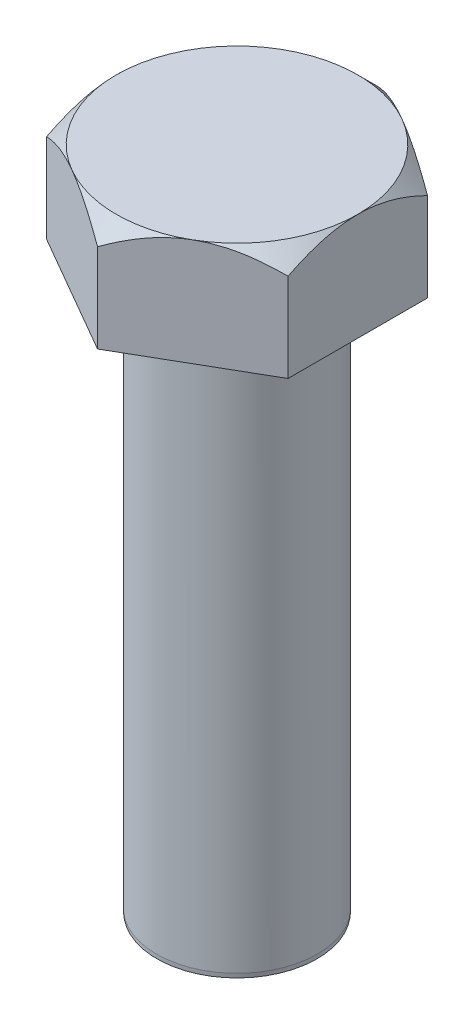
ISO-10303-21;
HEADER;
FILE_DESCRIPTION(('STEP AP214'),'2;1');
FILE_NAME('part.step','',(''),(''),'','','');
FILE_SCHEMA(('AUTOMOTIVE_DESIGN { 1 0 10303 214 1 1 1 1 }'));
ENDSEC;
DATA;
#1=APPLICATION_CONTEXT('core data for automotive mechanical design processes');
#2=APPLICATION_PROTOCOL_DEFINITION('international standard','automotive_design',2000,#1);
#3=PRODUCT_CONTEXT('',#1,'mechanical');
#4=PRODUCT('Part','Part','',(#3));
#5=PRODUCT_RELATED_PRODUCT_CATEGORY('part','',(#4));
#6=PRODUCT_DEFINITION_FORMATION('','',#4);
#7=PRODUCT_DEFINITION_CONTEXT('part definition',#1,'design');
#8=PRODUCT_DEFINITION('design','',#6,#7);
#9=PRODUCT_DEFINITION_SHAPE('','',#8);
#10=(LENGTH_UNIT() NAMED_UNIT(*) SI_UNIT(.MILLI.,.METRE.));
#11=(NAMED_UNIT(*) PLANE_ANGLE_UNIT() SI_UNIT($,.RADIAN.));
#12=(NAMED_UNIT(*) SI_UNIT($,.STERADIAN.) SOLID_ANGLE_UNIT());
#13=UNCERTAINTY_MEASURE_WITH_UNIT(LENGTH_MEASURE(1.E-05),#10,'distance_accuracy_value','');
#14=(GEOMETRIC_REPRESENTATION_CONTEXT(3) GLOBAL_UNCERTAINTY_ASSIGNED_CONTEXT((#13)) GLOBAL_UNIT_ASSIGNED_CONTEXT((#10,
#11,#12)) REPRESENTATION_CONTEXT('',''));
#15=CARTESIAN_POINT('',(0.,0.,0.));
#16=DIRECTION('',(0.,0.,1.));
#17=DIRECTION('',(1.,0.,0.));
#18=AXIS2_PLACEMENT_3D('',#15,#16,#17);
#19=CARTESIAN_POINT('',(7.15009999999996,6.35,-4.12811215973283));
#20=DIRECTION('',(-0.499999999999995,0.,0.866025403784441));
#21=DIRECTION('',(0.866025403784442,0.,0.499999999999995));
#22=AXIS2_PLACEMENT_3D('',#19,#20,#21);
#23=PLANE('',#22);
#24=CARTESIAN_POINT('',(7.15029999999996,5.24376020805829,-4.12799668967899));
#25=CARTESIAN_POINT('',(7.02735981479973,5.31473208114426,-4.19897623869856));
#26=CARTESIAN_POINT('',(6.90347465758507,5.38352591509957,-4.27050136756504));
#27=CARTESIAN_POINT('',(6.65362901516201,5.51609496244518,-4.41474981647385));
#28=CARTESIAN_POINT('',(6.52766744128796,5.57986743492815,-4.48747376505758));
#29=CARTESIAN_POINT('',(6.14521985336649,5.76320280111308,-4.70827998289497));
#30=CARTESIAN_POINT('',(5.88549626774101,5.87400155292641,-4.85823146497073));
#31=CARTESIAN_POINT('',(5.36174291484116,6.06373669034418,-5.16062060425642));
#32=CARTESIAN_POINT('',(5.09784700922402,6.14315107326227,-5.31298097640252));
#33=CARTESIAN_POINT('',(4.69766469893423,6.23501393674774,-5.54402634097325));
#34=CARTESIAN_POINT('',(4.56368142899528,6.26107948825729,-5.62138161793941));
#35=CARTESIAN_POINT('',(4.29458046497126,6.30353452510466,-5.77674713195786));
#36=CARTESIAN_POINT('',(4.15946294347778,6.319925456437,-5.85475726936435));
#37=CARTESIAN_POINT('',(3.83019852397778,6.34740730224126,-6.04485817059725));
#38=CARTESIAN_POINT('',(3.63569685436158,6.35317340265754,-6.15715376190799));
#39=CARTESIAN_POINT('',(3.24704409240871,6.34349459202812,-6.38154253864277));
#40=CARTESIAN_POINT('',(3.05289314684432,6.32804224579773,-6.49363563932778));
#41=CARTESIAN_POINT('',(2.66642169813378,6.27683739902505,-6.71676503427492));
#42=CARTESIAN_POINT('',(2.47410348685935,6.24106219749936,-6.82780000532428));
#43=CARTESIAN_POINT('',(2.09277255135678,6.15115660179108,-7.04796152358701));
#44=CARTESIAN_POINT('',(1.90375957482909,6.09702761510223,-7.15708821646561));
#45=CARTESIAN_POINT('',(1.56823093998172,5.98566881448239,-7.35080576411556));
#46=CARTESIAN_POINT('',(1.42097225552798,5.93136793728872,-7.43582560522543));
#47=CARTESIAN_POINT('',(1.12909829468736,5.81401595028394,-7.6043391150862));
#48=CARTESIAN_POINT('',(0.984483098549458,5.75096457532957,-7.68783273750533));
#49=CARTESIAN_POINT('',(0.6983516080155,5.61752492778284,-7.85303083058874));
#50=CARTESIAN_POINT('',(0.55682717595113,5.54715972840591,-7.93473999953801));
#51=CARTESIAN_POINT('',(0.276398890261677,5.40001620595466,-8.0966453457692));
#52=CARTESIAN_POINT('',(0.137493492810105,5.32324181558632,-8.17684241437976));
#53=CARTESIAN_POINT('',(-0.000199999999999894,5.24376020805829,-8.25633978951933));
#54=B_SPLINE_CURVE_WITH_KNOTS('',3,(#24,#25,#26,#27,#28,#29,#30,#31,#32,#33,#34,#35,#36,#37,#38,
#39,#40,#41,#42,#43,#44,#45,#46,#47,#48,#49,#50,#51,#52,#53),.UNSPECIFIED.,.F.,.F.,(4,2,2,2,2,2,
2,2,2,2,2,2,2,2,4),(0.,0.476107132166216,0.952472371030046,1.91034566100054,2.85300915505907,
3.32341643946382,3.7937533977268,4.46670173744884,5.13988594609707,5.81382359601269,
6.48770957546597,7.02295690652281,7.55822045931063,8.09184389327706,8.6251422671035),.UNSPECIFIED.);
#55=CARTESIAN_POINT('',(7.15009999999996,5.24387568053451,-4.12811215973283));
#56=VERTEX_POINT('',#55);
#57=CARTESIAN_POINT('',(3.57504999999996,6.35,-6.19216823959914));
#58=VERTEX_POINT('',#57);
#59=EDGE_CURVE('E106',#56,#58,#54,.T.);
#60=ORIENTED_EDGE('',*,*,#59,.F.);
#61=DIRECTION('',(0.,-1.,0.));
#62=VECTOR('',#61,1.);
#63=CARTESIAN_POINT('',(7.15009999999996,6.35,-4.12811215973283));
#64=LINE('',#63,#62);
#65=CARTESIAN_POINT('',(7.15009999999996,0.,-4.12811215973283));
#66=VERTEX_POINT('',#65);
#67=EDGE_CURVE('E273',#56,#66,#64,.T.);
#68=ORIENTED_EDGE('',*,*,#67,.T.);
#69=DIRECTION('',(-0.866025403784441,0.,-0.499999999999995));
#70=VECTOR('',#69,1.);
#71=CARTESIAN_POINT('',(7.15009999999996,0.,-4.12811215973283));
#72=LINE('',#71,#70);
#73=CARTESIAN_POINT('',(0.,0.,-8.25622431946549));
#74=VERTEX_POINT('',#73);
#75=EDGE_CURVE('E115',#66,#74,#72,.T.);
#76=ORIENTED_EDGE('',*,*,#75,.T.);
#77=DIRECTION('',(0.,-1.,0.));
#78=VECTOR('',#77,1.);
#79=CARTESIAN_POINT('',(0.,6.35,-8.25622431946549));
#80=LINE('',#79,#78);
#81=CARTESIAN_POINT('',(0.,5.24387568053451,-8.25622431946549));
#82=VERTEX_POINT('',#81);
#83=EDGE_CURVE('E133',#82,#74,#80,.T.);
#84=ORIENTED_EDGE('',*,*,#83,.F.);
#85=EDGE_CURVE('E116',#58,#82,#54,.T.);
#86=ORIENTED_EDGE('',*,*,#85,.F.);
#87=EDGE_LOOP('',(#60,#68,#76,#84,#86));
#88=FACE_BOUND('',#87,.T.);
#89=ADVANCED_FACE('F36',(#88),#23,.F.);
#90=CARTESIAN_POINT('',(0.,6.35,-8.25622431946549));
#91=DIRECTION('',(0.500000000000001,0.,0.866025403784438));
#92=DIRECTION('',(0.866025403784438,0.,-0.500000000000001));
#93=AXIS2_PLACEMENT_3D('',#90,#91,#92);
#94=PLANE('',#93);
#95=CARTESIAN_POINT('',(0.0002,5.24376020805829,-8.25633978951933));
#96=CARTESIAN_POINT('',(-0.122740185200222,5.31473208114426,-8.18536024049976));
#97=CARTESIAN_POINT('',(-0.246625342414885,5.38352591509958,-8.11383511163327));
#98=CARTESIAN_POINT('',(-0.496470984837945,5.51609496244519,-7.96958666272447));
#99=CARTESIAN_POINT('',(-0.622432558711996,5.57986743492816,-7.89686271414073));
#100=CARTESIAN_POINT('',(-1.00488014663348,5.76320280111309,-7.67605649630334));
#101=CARTESIAN_POINT('',(-1.26460373225895,5.87400155292642,-7.52610501422758));
#102=CARTESIAN_POINT('',(-1.78835708515881,6.06373669034419,-7.22371587494188));
#103=CARTESIAN_POINT('',(-2.05225299077595,6.1431510732623,-7.07135550279578));
#104=CARTESIAN_POINT('',(-2.45243530106574,6.23501393674777,-6.84031013822504));
#105=CARTESIAN_POINT('',(-2.58641857100469,6.26107948825732,-6.76295486125888));
#106=CARTESIAN_POINT('',(-2.85551953502872,6.30353452510469,-6.60758934724042));
#107=CARTESIAN_POINT('',(-2.99063705652219,6.31992545643702,-6.52957920983393));
#108=CARTESIAN_POINT('',(-3.3199014760222,6.34740730224129,-6.33947830860103));
#109=CARTESIAN_POINT('',(-3.51440314563839,6.35317340265757,-6.22718271729029));
#110=CARTESIAN_POINT('',(-3.90305590759126,6.34349459202815,-6.00279394055551));
#111=CARTESIAN_POINT('',(-4.09720685315564,6.32804224579776,-5.89070083987049));
#112=CARTESIAN_POINT('',(-4.48367830186619,6.27683739902508,-5.66757144492336));
#113=CARTESIAN_POINT('',(-4.67599651314062,6.24106219749939,-5.556536473874));
#114=CARTESIAN_POINT('',(-5.05732744864318,6.15115660179112,-5.33637495561126));
#115=CARTESIAN_POINT('',(-5.24634042517087,6.09702761510226,-5.22724826273266));
#116=CARTESIAN_POINT('',(-5.58186906001824,5.98566881448243,-5.03353071508271));
#117=CARTESIAN_POINT('',(-5.72912774447198,5.93136793728875,-4.94851087397283));
#118=CARTESIAN_POINT('',(-6.02100170531261,5.81401595028396,-4.77999736411205));
#119=CARTESIAN_POINT('',(-6.16561690145052,5.7509645753296,-4.69650374169292));
#120=CARTESIAN_POINT('',(-6.45174839198449,5.61752492778286,-4.5313056486095));
#121=CARTESIAN_POINT('',(-6.59327282404887,5.54715972840593,-4.44959647966022));
#122=CARTESIAN_POINT('',(-6.87370110973833,5.40001620595466,-4.28769113342903));
#123=CARTESIAN_POINT('',(-7.0126065071899,5.32324181558632,-4.20749406481847));
#124=CARTESIAN_POINT('',(-7.15030000000001,5.24376020805829,-4.12799668967889));
#125=B_SPLINE_CURVE_WITH_KNOTS('',3,(#95,#96,#97,#98,#99,#100,#101,#102,#103,#104,#105,#106,
#107,#108,#109,#110,#111,#112,#113,#114,#115,#116,#117,#118,#119,#120,#121,#122,#123,#124),
.UNSPECIFIED.,.F.,.F.,(4,2,2,2,2,2,2,2,2,2,2,2,2,2,4),(0.,0.476107132166221,0.952472371030056,
1.91034566100056,2.85300915505911,3.32341643946385,3.79375339772684,4.46670173744889,
5.13988594609711,5.81382359601273,6.48770957546601,7.02295690652286,7.55822045931071,
8.09184389327715,8.62514226710361),.UNSPECIFIED.);
#126=CARTESIAN_POINT('',(-3.57505000000001,6.35,-6.19216823959911));
#127=VERTEX_POINT('',#126);
#128=EDGE_CURVE('E123',#82,#127,#125,.T.);
#129=ORIENTED_EDGE('',*,*,#128,.F.);
#130=ORIENTED_EDGE('',*,*,#83,.T.);
#131=DIRECTION('',(-0.866025403784438,0.,0.500000000000001));
#132=VECTOR('',#131,1.);
#133=CARTESIAN_POINT('',(0.,0.,-8.25622431946549));
#134=LINE('',#133,#132);
#135=CARTESIAN_POINT('',(-7.15010000000001,0.,-4.12811215973273));
#136=VERTEX_POINT('',#135);
#137=EDGE_CURVE('E264',#74,#136,#134,.T.);
#138=ORIENTED_EDGE('',*,*,#137,.T.);
#139=DIRECTION('',(0.,-1.,0.));
#140=VECTOR('',#139,1.);
#141=CARTESIAN_POINT('',(-7.15010000000001,6.35,-4.12811215973273));
#142=LINE('',#141,#140);
#143=CARTESIAN_POINT('',(-7.15010000000001,5.24387568053451,-4.12811215973273));
#144=VERTEX_POINT('',#143);
#145=EDGE_CURVE('E206',#144,#136,#142,.T.);
#146=ORIENTED_EDGE('',*,*,#145,.F.);
#147=EDGE_CURVE('E134',#127,#144,#125,.T.);
#148=ORIENTED_EDGE('',*,*,#147,.F.);
#149=EDGE_LOOP('',(#129,#130,#138,#146,#148));
#150=FACE_BOUND('',#149,.T.);
#151=ADVANCED_FACE('F194',(#150),#94,.F.);
#152=CARTESIAN_POINT('',(-7.15010000000001,6.35,-4.12811215973273));
#153=DIRECTION('',(1.,0.,0.));
#154=DIRECTION('',(0.,0.,-1.));
#155=AXIS2_PLACEMENT_3D('',#152,#153,#154);
#156=PLANE('',#155);
#157=CARTESIAN_POINT('',(-7.15010000000003,1.63089085788719,-9.47386909605649));
#158=CARTESIAN_POINT('',(-7.15010000000003,1.81121581560539,-9.24790249070521));
#159=CARTESIAN_POINT('',(-7.15010000000003,1.99016418725543,-9.02082114931031));
#160=CARTESIAN_POINT('',(-7.15010000000003,2.34465316669975,-8.56394073706759));
#161=CARTESIAN_POINT('',(-7.15010000000003,2.5201930563962,-8.33414110959574));
#162=CARTESIAN_POINT('',(-7.15010000000003,2.868446395647,-7.86968034981608));
#163=CARTESIAN_POINT('',(-7.15010000000003,3.0411284373893,-7.63499559658916));
#164=CARTESIAN_POINT('',(-7.15010000000002,3.38131039804522,-7.16191403046406));
#165=CARTESIAN_POINT('',(-7.15010000000002,3.54881066036877,-6.92351746513816));
#166=CARTESIAN_POINT('',(-7.15010000000002,3.89019859321875,-6.42356671095031));
#167=CARTESIAN_POINT('',(-7.15010000000002,4.06356649358224,-6.16165586234294));
#168=CARTESIAN_POINT('',(-7.15010000000002,4.40077381694092,-5.63166319550724));
#169=CARTESIAN_POINT('',(-7.15010000000002,4.56461143837196,-5.36358022380933));
#170=CARTESIAN_POINT('',(-7.15010000000002,4.87937516438839,-4.82096243326766));
#171=CARTESIAN_POINT('',(-7.15010000000002,5.03033869234989,-4.54644949317194));
#172=CARTESIAN_POINT('',(-7.15010000000001,5.31597281014485,-3.98913965325442));
#173=CARTESIAN_POINT('',(-7.15010000000001,5.45065169434768,-3.70634706251455));
#174=CARTESIAN_POINT('',(-7.15010000000001,5.68224395499392,-3.16946720873966));
#175=CARTESIAN_POINT('',(-7.15010000000001,5.78179628197522,-2.91652981738955));
#176=CARTESIAN_POINT('',(-7.15010000000001,5.96068130805078,-2.40346766112692));
#177=CARTESIAN_POINT('',(-7.15010000000001,6.04001286165642,-2.14334248995796));
#178=CARTESIAN_POINT('',(-7.1501,6.17245096820923,-1.62248495464225));
#179=CARTESIAN_POINT('',(-7.1501,6.22609680418521,-1.36189223637387));
#180=CARTESIAN_POINT('',(-7.1501,6.30590762943054,-0.836507861915944));
#181=CARTESIAN_POINT('',(-7.1501,6.33208104018206,-0.571717517759924));
#182=CARTESIAN_POINT('',(-7.1501,6.35408284405149,-0.0577187353176461));
#183=CARTESIAN_POINT('',(-7.1501,6.35173239837544,0.19141159314656));
#184=CARTESIAN_POINT('',(-7.1501,6.32124800606946,0.688077635906895));
#185=CARTESIAN_POINT('',(-7.1501,6.29311214694111,0.935613230550542));
#186=CARTESIAN_POINT('',(-7.15009999999999,6.21229082442829,1.43154670462864));
#187=CARTESIAN_POINT('',(-7.15009999999999,6.15913527095504,1.6798664946589));
#188=CARTESIAN_POINT('',(-7.15009999999999,6.03147971556139,2.17085918647798));
#189=CARTESIAN_POINT('',(-7.15009999999999,5.9569795257941,2.4135320385497));
#190=CARTESIAN_POINT('',(-7.15009999999999,5.79048248965085,2.89215321636684));
#191=CARTESIAN_POINT('',(-7.15009999999999,5.69852189244993,3.12811432942166));
#192=CARTESIAN_POINT('',(-7.15009999999999,5.50032506783947,3.59401612680425));
#193=CARTESIAN_POINT('',(-7.15009999999999,5.39408271156479,3.8239541754974));
#194=CARTESIAN_POINT('',(-7.15009999999998,5.16984050461004,4.27885242834733));
#195=CARTESIAN_POINT('',(-7.15009999999998,5.05180562125056,4.50379521875785));
#196=CARTESIAN_POINT('',(-7.15009999999998,4.80656023664318,4.94854616944678));
#197=CARTESIAN_POINT('',(-7.15009999999998,4.67935108776111,5.168355080205));
#198=CARTESIAN_POINT('',(-7.15009999999998,4.42401096856745,5.59273981639913));
#199=CARTESIAN_POINT('',(-7.15009999999998,4.29623669089792,5.79753139755686));
#200=CARTESIAN_POINT('',(-7.15009999999998,4.03519862932643,6.20359582585859));
#201=CARTESIAN_POINT('',(-7.15009999999998,3.90193444245225,6.4048684131501));
#202=CARTESIAN_POINT('',(-7.15009999999998,3.63195773249821,6.80275896707806));
#203=CARTESIAN_POINT('',(-7.15009999999998,3.49528075722348,6.9994011408559));
#204=CARTESIAN_POINT('',(-7.15009999999997,3.21822330604325,7.38998078224734));
#205=CARTESIAN_POINT('',(-7.15009999999997,3.0778438588743,7.58391897874123));
#206=CARTESIAN_POINT('',(-7.15009999999997,2.93594735354651,7.77672110388246));
#207=B_SPLINE_CURVE_WITH_KNOTS('',3,(#157,#158,#159,#160,#161,#162,#163,#164,#165,#166,#167,
#168,#169,#170,#171,#172,#173,#174,#175,#176,#177,#178,#179,#180,#181,#182,#183,#184,#185,#186,
#187,#188,#189,#190,#191,#192,#193,#194,#195,#196,#197,#198,#199,#200,#201,#202,#203,#204,#205,
#206),.UNSPECIFIED.,.F.,.F.,(4,2,2,2,2,2,2,2,2,2,2,2,2,2,2,2,2,2,2,2,2,2,2,2,4),(0.,
0.867309176171177,1.73479913643537,2.60884845848508,3.48283973039317,4.42495432930787,
5.36724644671029,6.30669878036595,7.24567058249782,8.06046150623437,8.87529857688988,
9.67218308312768,10.4688232385201,11.214882925787,11.9609979526155,12.7217281313764,
13.4824650052708,14.2416394652586,15.0011407631884,15.7629695239043,16.524686213128,
17.248733545678,17.9728341200296,18.6912157430264,19.4093998229271),.UNSPECIFIED.);
#208=CARTESIAN_POINT('',(-7.1501,6.35,0.));
#209=VERTEX_POINT('',#208);
#210=EDGE_CURVE('E188',#144,#209,#207,.T.);
#211=ORIENTED_EDGE('',*,*,#210,.F.);
#212=ORIENTED_EDGE('',*,*,#145,.T.);
#213=DIRECTION('',(0.,0.,1.));
#214=VECTOR('',#213,1.);
#215=CARTESIAN_POINT('',(-7.15010000000001,0.,-4.12811215973273));
#216=LINE('',#215,#214);
#217=CARTESIAN_POINT('',(-7.15009999999999,0.,4.12811215973278));
#218=VERTEX_POINT('',#217);
#219=EDGE_CURVE('E223',#136,#218,#216,.T.);
#220=ORIENTED_EDGE('',*,*,#219,.T.);
#221=DIRECTION('',(0.,-1.,0.));
#222=VECTOR('',#221,1.);
#223=CARTESIAN_POINT('',(-7.15009999999999,6.35,4.12811215973278));
#224=LINE('',#223,#222);
#225=CARTESIAN_POINT('',(-7.15009999999999,5.24387568053451,4.12811215973278));
#226=VERTEX_POINT('',#225);
#227=EDGE_CURVE('E221',#226,#218,#224,.T.);
#228=ORIENTED_EDGE('',*,*,#227,.F.);
#229=EDGE_CURVE('E182',#209,#226,#207,.T.);
#230=ORIENTED_EDGE('',*,*,#229,.F.);
#231=EDGE_LOOP('',(#211,#212,#220,#228,#230));
#232=FACE_BOUND('',#231,.T.);
#233=ADVANCED_FACE('F190',(#232),#156,.F.);
#234=CARTESIAN_POINT('',(-7.15009999999999,6.35,4.12811215973278));
#235=DIRECTION('',(0.499999999999995,0.,-0.866025403784441));
#236=DIRECTION('',(-0.866025403784441,0.,-0.499999999999995));
#237=AXIS2_PLACEMENT_3D('',#234,#235,#236);
#238=PLANE('',#237);
#239=CARTESIAN_POINT('',(-7.15029999999998,5.24376020805829,4.12799668967894));
#240=CARTESIAN_POINT('',(-7.02735981479976,5.31473208114426,4.19897623869851));
#241=CARTESIAN_POINT('',(-6.9034746575851,5.38352591509958,4.27050136756499));
#242=CARTESIAN_POINT('',(-6.65362901516204,5.51609496244519,4.4147498164738));
#243=CARTESIAN_POINT('',(-6.52766744128798,5.57986743492816,4.48747376505753));
#244=CARTESIAN_POINT('',(-6.1452198533665,5.76320280111309,4.70827998289492));
#245=CARTESIAN_POINT('',(-5.88549626774103,5.87400155292642,4.85823146497068));
#246=CARTESIAN_POINT('',(-5.36174291484117,6.06373669034419,5.16062060425638));
#247=CARTESIAN_POINT('',(-5.09784700922402,6.1431510732623,5.31298097640248));
#248=CARTESIAN_POINT('',(-4.69766469893423,6.23501393674777,5.54402634097321));
#249=CARTESIAN_POINT('',(-4.56368142899528,6.26107948825732,5.62138161793937));
#250=CARTESIAN_POINT('',(-4.29458046497126,6.30353452510469,5.77674713195783));
#251=CARTESIAN_POINT('',(-4.15946294347778,6.31992545643702,5.85475726936432));
#252=CARTESIAN_POINT('',(-3.83019852397777,6.34740730224129,6.04485817059721));
#253=CARTESIAN_POINT('',(-3.63569685436158,6.35317340265757,6.15715376190795));
#254=CARTESIAN_POINT('',(-3.24704409240871,6.34349459202815,6.38154253864273));
#255=CARTESIAN_POINT('',(-3.05289314684433,6.32804224579776,6.49363563932775));
#256=CARTESIAN_POINT('',(-2.66642169813378,6.27683739902508,6.71676503427488));
#257=CARTESIAN_POINT('',(-2.47410348685935,6.24106219749939,6.82780000532424));
#258=CARTESIAN_POINT('',(-2.09277255135678,6.15115660179112,7.04796152358698));
#259=CARTESIAN_POINT('',(-1.90375957482909,6.09702761510226,7.15708821646557));
#260=CARTESIAN_POINT('',(-1.56823093998172,5.98566881448243,7.35080576411552));
#261=CARTESIAN_POINT('',(-1.42097225552798,5.93136793728875,7.4358256052254));
#262=CARTESIAN_POINT('',(-1.12909829468735,5.81401595028396,7.60433911508618));
#263=CARTESIAN_POINT('',(-0.984483098549436,5.7509645753296,7.68783273750531));
#264=CARTESIAN_POINT('',(-0.698351608015466,5.61752492778286,7.85303083058873));
#265=CARTESIAN_POINT('',(-0.556827175951092,5.54715972840593,7.934739999538));
#266=CARTESIAN_POINT('',(-0.276398890261629,5.40001620595466,8.0966453457692));
#267=CARTESIAN_POINT('',(-0.137493492810052,5.32324181558632,8.17684241437975));
#268=CARTESIAN_POINT('',(0.000200000000057124,5.24376020805829,8.25633978951933));
#269=B_SPLINE_CURVE_WITH_KNOTS('',3,(#239,#240,#241,#242,#243,#244,#245,#246,#247,#248,#249,
#250,#251,#252,#253,#254,#255,#256,#257,#258,#259,#260,#261,#262,#263,#264,#265,#266,#267,#268),
.UNSPECIFIED.,.F.,.F.,(4,2,2,2,2,2,2,2,2,2,2,2,2,2,4),(0.,0.476107132166221,0.952472371030058,
1.91034566100057,2.85300915505911,3.32341643946385,3.79375339772684,4.46670173744888,
5.13988594609711,5.81382359601273,6.48770957546601,7.02295690652286,7.55822045931071,
8.09184389327715,8.62514226710361),.UNSPECIFIED.);
#270=CARTESIAN_POINT('',(-3.57504999999996,6.35,6.19216823959913));
#271=VERTEX_POINT('',#270);
#272=EDGE_CURVE('E189',#226,#271,#269,.T.);
#273=ORIENTED_EDGE('',*,*,#272,.F.);
#274=ORIENTED_EDGE('',*,*,#227,.T.);
#275=DIRECTION('',(0.866025403784441,0.,0.499999999999995));
#276=VECTOR('',#275,1.);
#277=CARTESIAN_POINT('',(-7.15009999999999,0.,4.12811215973278));
#278=LINE('',#277,#276);
#279=CARTESIAN_POINT('',(0.,0.,8.25622431946549));
#280=VERTEX_POINT('',#279);
#281=EDGE_CURVE('E265',#218,#280,#278,.T.);
#282=ORIENTED_EDGE('',*,*,#281,.T.);
#283=DIRECTION('',(0.,-1.,0.));
#284=VECTOR('',#283,1.);
#285=CARTESIAN_POINT('',(0.,6.35,8.25622431946549));
#286=LINE('',#285,#284);
#287=CARTESIAN_POINT('',(0.,5.24387568053451,8.25622431946549));
#288=VERTEX_POINT('',#287);
#289=EDGE_CURVE('E227',#288,#280,#286,.T.);
#290=ORIENTED_EDGE('',*,*,#289,.F.);
#291=EDGE_CURVE('E176',#271,#288,#269,.T.);
#292=ORIENTED_EDGE('',*,*,#291,.F.);
#293=EDGE_LOOP('',(#273,#274,#282,#290,#292));
#294=FACE_BOUND('',#293,.T.);
#295=ADVANCED_FACE('F193',(#294),#238,.F.);
#296=CARTESIAN_POINT('',(0.,6.35,8.25622431946549));
#297=DIRECTION('',(-0.500000000000007,0.,-0.866025403784435));
#298=DIRECTION('',(-0.866025403784435,0.,0.500000000000007));
#299=AXIS2_PLACEMENT_3D('',#296,#297,#298);
#300=PLANE('',#299);
#301=CARTESIAN_POINT('',(-0.000199999999942347,5.24376020805829,8.25633978951933));
#302=CARTESIAN_POINT('',(0.122740185200279,5.31473208114426,8.18536024049976));
#303=CARTESIAN_POINT('',(0.246625342414941,5.38352591509958,8.11383511163327));
#304=CARTESIAN_POINT('',(0.496470984838001,5.51609496244519,7.96958666272446));
#305=CARTESIAN_POINT('',(0.622432558712051,5.57986743492816,7.89686271414073));
#306=CARTESIAN_POINT('',(1.00488014663353,5.76320280111309,7.67605649630334));
#307=CARTESIAN_POINT('',(1.264603732259,5.87400155292642,7.52610501422757));
#308=CARTESIAN_POINT('',(1.78835708515886,6.06373669034419,7.22371587494186));
#309=CARTESIAN_POINT('',(2.052252990776,6.1431510732623,7.07135550279576));
#310=CARTESIAN_POINT('',(2.45243530106579,6.23501393674777,6.84031013822502));
#311=CARTESIAN_POINT('',(2.58641857100474,6.26107948825731,6.76295486125886));
#312=CARTESIAN_POINT('',(2.85551953502876,6.30353452510469,6.6075893472404));
#313=CARTESIAN_POINT('',(2.99063705652223,6.31992545643702,6.52957920983391));
#314=CARTESIAN_POINT('',(3.31990147602224,6.34740730224129,6.33947830860101));
#315=CARTESIAN_POINT('',(3.51440314563843,6.35317340265757,6.22718271729027));
#316=CARTESIAN_POINT('',(3.9030559075913,6.34349459202815,6.00279394055549));
#317=CARTESIAN_POINT('',(4.09720685315568,6.32804224579776,5.89070083987047));
#318=CARTESIAN_POINT('',(4.48367830186623,6.27683739902508,5.66757144492333));
#319=CARTESIAN_POINT('',(4.67599651314065,6.24106219749939,5.55653647387397));
#320=CARTESIAN_POINT('',(5.05732744864322,6.15115660179112,5.33637495561122));
#321=CARTESIAN_POINT('',(5.24634042517091,6.09702761510226,5.22724826273263));
#322=CARTESIAN_POINT('',(5.58186906001828,5.98566881448243,5.03353071508267));
#323=CARTESIAN_POINT('',(5.72912774447202,5.93136793728875,4.94851087397279));
#324=CARTESIAN_POINT('',(6.02100170531265,5.81401595028396,4.77999736411201));
#325=CARTESIAN_POINT('',(6.16561690145056,5.7509645753296,4.69650374169287));
#326=CARTESIAN_POINT('',(6.45174839198452,5.61752492778285,4.53130564860946));
#327=CARTESIAN_POINT('',(6.5932728240489,5.54715972840592,4.44959647966018));
#328=CARTESIAN_POINT('',(6.87370110973836,5.40001620595466,4.28769113342898));
#329=CARTESIAN_POINT('',(7.01260650718993,5.32324181558632,4.20749406481842));
#330=CARTESIAN_POINT('',(7.15030000000004,5.24376020805829,4.12799668967884));
#331=B_SPLINE_CURVE_WITH_KNOTS('',3,(#301,#302,#303,#304,#305,#306,#307,#308,#309,#310,#311,
#312,#313,#314,#315,#316,#317,#318,#319,#320,#321,#322,#323,#324,#325,#326,#327,#328,#329,#330),
.UNSPECIFIED.,.F.,.F.,(4,2,2,2,2,2,2,2,2,2,2,2,2,2,4),(0.,0.476107132166222,0.952472371030056,
1.91034566100056,2.8530091550591,3.32341643946385,3.79375339772684,4.46670173744888,
5.13988594609711,5.81382359601273,6.48770957546601,7.02295690652286,7.55822045931071,
8.09184389327715,8.62514226710361),.UNSPECIFIED.);
#332=CARTESIAN_POINT('',(3.57505000000005,6.35,6.19216823959909));
#333=VERTEX_POINT('',#332);
#334=EDGE_CURVE('E284',#288,#333,#331,.T.);
#335=ORIENTED_EDGE('',*,*,#334,.F.);
#336=ORIENTED_EDGE('',*,*,#289,.T.);
#337=DIRECTION('',(0.866025403784435,0.,-0.500000000000007));
#338=VECTOR('',#337,1.);
#339=CARTESIAN_POINT('',(0.,0.,8.25622431946549));
#340=LINE('',#339,#338);
#341=CARTESIAN_POINT('',(7.15010000000004,0.,4.12811215973268));
#342=VERTEX_POINT('',#341);
#343=EDGE_CURVE('E269',#280,#342,#340,.T.);
#344=ORIENTED_EDGE('',*,*,#343,.T.);
#345=DIRECTION('',(0.,-1.,0.));
#346=VECTOR('',#345,1.);
#347=CARTESIAN_POINT('',(7.15010000000004,6.35,4.12811215973268));
#348=LINE('',#347,#346);
#349=CARTESIAN_POINT('',(7.15010000000004,5.24387568053451,4.12811215973268));
#350=VERTEX_POINT('',#349);
#351=EDGE_CURVE('E230',#350,#342,#348,.T.);
#352=ORIENTED_EDGE('',*,*,#351,.F.);
#353=EDGE_CURVE('E169',#333,#350,#331,.T.);
#354=ORIENTED_EDGE('',*,*,#353,.F.);
#355=EDGE_LOOP('',(#335,#336,#344,#352,#354));
#356=FACE_BOUND('',#355,.T.);
#357=ADVANCED_FACE('F281',(#356),#300,.F.);
#358=CARTESIAN_POINT('',(7.15010000000004,6.35,4.12811215973268));
#359=DIRECTION('',(-1.,0.,0.));
#360=DIRECTION('',(0.,0.,1.));
#361=AXIS2_PLACEMENT_3D('',#358,#359,#360);
#362=PLANE('',#361);
#363=CARTESIAN_POINT('',(7.1500999999999,1.63089084568141,-9.47386911134843));
#364=CARTESIAN_POINT('',(7.1500999999999,1.8112158038748,-9.24790250553399));
#365=CARTESIAN_POINT('',(7.15009999999991,1.9901641759994,-9.02082116367475));
#366=CARTESIAN_POINT('',(7.15009999999991,2.34465315639033,-8.56394075049952));
#367=CARTESIAN_POINT('',(7.15009999999991,2.52019304655884,-8.33414112255949));
#368=CARTESIAN_POINT('',(7.15009999999992,2.86844638675769,-7.86968036182892));
#369=CARTESIAN_POINT('',(7.15009999999992,3.04112842897584,-7.63499560811917));
#370=CARTESIAN_POINT('',(7.15009999999992,3.38131039057672,-7.16191404102097));
#371=CARTESIAN_POINT('',(7.15009999999993,3.54881065336935,-6.92351747520483));
#372=CARTESIAN_POINT('',(7.15009999999993,3.89019858720553,-6.42356671995492));
#373=CARTESIAN_POINT('',(7.15009999999994,4.06356648808435,-6.16165587077427));
#374=CARTESIAN_POINT('',(7.15009999999994,4.40077381245204,-5.63166320277258));
#375=CARTESIAN_POINT('',(7.15009999999994,4.56461143437675,-5.36358023048195));
#376=CARTESIAN_POINT('',(7.15009999999995,4.87937516134173,-4.82096243873408));
#377=CARTESIAN_POINT('',(7.15009999999995,5.03033868975839,-4.54644949802505));
#378=CARTESIAN_POINT('',(7.15009999999996,5.31597280840798,-3.98913965684663));
#379=CARTESIAN_POINT('',(7.15009999999996,5.45065169301035,-3.7063470654592));
#380=CARTESIAN_POINT('',(7.15009999999997,5.68224395389446,-3.16946721142345));
#381=CARTESIAN_POINT('',(7.15009999999997,5.7817962807887,-2.91652982049303));
#382=CARTESIAN_POINT('',(7.15009999999997,5.96068130677324,-2.40346766509055));
#383=CARTESIAN_POINT('',(7.15009999999998,6.04001286037489,-2.14334249436203));
#384=CARTESIAN_POINT('',(7.15009999999998,6.17245096702639,-1.62248495991549));
#385=CARTESIAN_POINT('',(7.15009999999999,6.22609680310152,-1.36189224207524));
#386=CARTESIAN_POINT('',(7.15009999999999,6.30590762865255,-0.836507868466953));
#387=CARTESIAN_POINT('',(7.15009999999999,6.33208103961055,-0.571717524732427));
#388=CARTESIAN_POINT('',(7.1501,6.35408284398224,-0.057718742911977));
#389=CARTESIAN_POINT('',(7.1501,6.35173239857837,0.191411585350977));
#390=CARTESIAN_POINT('',(7.15010000000001,6.32124800684642,0.688077627739453));
#391=CARTESIAN_POINT('',(7.15010000000001,6.29311214801996,0.935613222212498));
#392=CARTESIAN_POINT('',(7.15010000000001,6.2122908261277,1.43154669595436));
#393=CARTESIAN_POINT('',(7.15010000000002,6.15913527297532,1.67986648581989));
#394=CARTESIAN_POINT('',(7.15010000000002,6.03147971821725,2.17085917733268));
#395=CARTESIAN_POINT('',(7.15010000000002,5.95697952876465,2.41353202926283));
#396=CARTESIAN_POINT('',(7.15010000000003,5.79048249349503,2.89215320606262));
#397=CARTESIAN_POINT('',(7.15010000000003,5.69852189690814,3.12811431826103));
#398=CARTESIAN_POINT('',(7.15010000000004,5.50032507358712,3.59401611397431));
#399=CARTESIAN_POINT('',(7.15010000000004,5.39408271798793,3.82395416185457));
#400=CARTESIAN_POINT('',(7.15010000000004,5.16984051242519,4.27885241310805));
#401=CARTESIAN_POINT('',(7.15010000000005,5.05180562978249,4.50379520273518));
#402=CARTESIAN_POINT('',(7.15010000000005,4.80656024663132,4.94854615188308));
#403=CARTESIAN_POINT('',(7.15010000000005,4.67935109848869,5.16835506188367));
#404=CARTESIAN_POINT('',(7.15010000000006,4.42401098069604,5.59273979670796));
#405=CARTESIAN_POINT('',(7.15010000000006,4.29623670368454,5.79753137725083));
#406=CARTESIAN_POINT('',(7.15010000000007,4.03519864343176,6.20359580433172));
#407=CARTESIAN_POINT('',(7.15010000000007,3.90193445721827,6.40486839101724));
#408=CARTESIAN_POINT('',(7.15010000000007,3.63195774857802,6.80275894374802));
#409=CARTESIAN_POINT('',(7.15010000000007,3.49528077395631,6.99940111693457));
#410=CARTESIAN_POINT('',(7.15010000000008,3.21822332408119,7.38998075714733));
#411=CARTESIAN_POINT('',(7.15010000000008,3.07784387756432,7.58391895305384));
#412=CARTESIAN_POINT('',(7.15010000000008,2.93594737288767,7.7767210776087));
#413=B_SPLINE_CURVE_WITH_KNOTS('',3,(#363,#364,#365,#366,#367,#368,#369,#370,#371,#372,#373,
#374,#375,#376,#377,#378,#379,#380,#381,#382,#383,#384,#385,#386,#387,#388,#389,#390,#391,#392,
#393,#394,#395,#396,#397,#398,#399,#400,#401,#402,#403,#404,#405,#406,#407,#408,#409,#410,#411,
#412),.UNSPECIFIED.,.F.,.F.,(4,2,2,2,2,2,2,2,2,2,2,2,2,2,2,2,2,2,2,2,2,2,2,2,4),(0.,
0.867309178146457,1.7347991403865,2.60884846444894,3.4828397383694,4.42495433957124,
5.36724645926233,6.30669879518682,7.24567059958342,8.06046152205712,8.87529859145194,
9.67218309649984,10.468823250704,11.2148829373626,11.9609979635813,12.7217281416573,
13.4824650148672,14.2416394717964,15.001140766664,15.7629695243005,16.524686210446,
17.248733540386,17.9728341121274,18.6912157325493,19.4093998098754),.UNSPECIFIED.);
#414=CARTESIAN_POINT('',(7.1501,6.35,0.));
#415=VERTEX_POINT('',#414);
#416=EDGE_CURVE('E277',#350,#415,#413,.F.);
#417=ORIENTED_EDGE('',*,*,#416,.F.);
#418=ORIENTED_EDGE('',*,*,#351,.T.);
#419=DIRECTION('',(0.,0.,-1.));
#420=VECTOR('',#419,1.);
#421=CARTESIAN_POINT('',(7.15010000000004,0.,4.12811215973268));
#422=LINE('',#421,#420);
#423=EDGE_CURVE('E263',#342,#66,#422,.T.);
#424=ORIENTED_EDGE('',*,*,#423,.T.);
#425=ORIENTED_EDGE('',*,*,#67,.F.);
#426=EDGE_CURVE('E111',#415,#56,#413,.F.);
#427=ORIENTED_EDGE('',*,*,#426,.F.);
#428=EDGE_LOOP('',(#417,#418,#424,#425,#427));
#429=FACE_BOUND('',#428,.T.);
#430=ADVANCED_FACE('F257',(#429),#362,.F.);
#431=CARTESIAN_POINT('',(0.,0.,0.));
#432=DIRECTION('',(0.,1.,0.));
#433=DIRECTION('',(0.,0.,1.));
#434=AXIS2_PLACEMENT_3D('',#431,#432,#433);
#435=PLANE('',#434);
#436=CARTESIAN_POINT('',(0.,0.,0.));
#437=DIRECTION('',(0.,1.,0.));
#438=DIRECTION('',(0.,0.,1.));
#439=AXIS2_PLACEMENT_3D('',#436,#437,#438);
#440=CIRCLE('',#439,4.7625);
#441=CARTESIAN_POINT('',(0.,0.,4.7625));
#442=VERTEX_POINT('',#441);
#443=EDGE_CURVE('E235',#442,#442,#440,.F.);
#444=ORIENTED_EDGE('',*,*,#443,.F.);
#445=EDGE_LOOP('',(#444));
#446=FACE_BOUND('',#445,.T.);
#447=ORIENTED_EDGE('',*,*,#75,.F.);
#448=ORIENTED_EDGE('',*,*,#423,.F.);
#449=ORIENTED_EDGE('',*,*,#343,.F.);
#450=ORIENTED_EDGE('',*,*,#281,.F.);
#451=ORIENTED_EDGE('',*,*,#219,.F.);
#452=ORIENTED_EDGE('',*,*,#137,.F.);
#453=EDGE_LOOP('',(#447,#448,#449,#450,#451,#452));
#454=FACE_BOUND('',#453,.T.);
#455=ADVANCED_FACE('F252',(#446,#454),#435,.F.);
#456=CARTESIAN_POINT('',(0.,-33.02,0.));
#457=DIRECTION('',(0.,1.,0.));
#458=DIRECTION('',(0.,0.,1.));
#459=AXIS2_PLACEMENT_3D('',#456,#457,#458);
#460=CYLINDRICAL_SURFACE('',#459,4.7625);
#461=CARTESIAN_POINT('',(0.,-32.7660000000003,0.));
#462=DIRECTION('',(0.,-1.,0.));
#463=DIRECTION('',(0.,0.,-1.));
#464=AXIS2_PLACEMENT_3D('',#461,#462,#463);
#465=CIRCLE('',#464,4.7625);
#466=CARTESIAN_POINT('',(0.,-32.7660000000003,-4.7625));
#467=VERTEX_POINT('',#466);
#468=EDGE_CURVE('E12',#467,#467,#465,.F.);
#469=ORIENTED_EDGE('',*,*,#468,.T.);
#470=EDGE_LOOP('',(#469));
#471=FACE_BOUND('',#470,.T.);
#472=ORIENTED_EDGE('',*,*,#443,.T.);
#473=EDGE_LOOP('',(#472));
#474=FACE_BOUND('',#473,.T.);
#475=ADVANCED_FACE('F249',(#471,#474),#460,.T.);
#476=CARTESIAN_POINT('',(0.,-33.02,0.));
#477=DIRECTION('',(0.,-1.,0.));
#478=DIRECTION('',(0.,0.,-1.));
#479=AXIS2_PLACEMENT_3D('',#476,#477,#478);
#480=PLANE('',#479);
#481=CARTESIAN_POINT('',(0.,-33.02,0.));
#482=DIRECTION('',(0.,-1.,0.));
#483=DIRECTION('',(0.,0.,-1.));
#484=AXIS2_PLACEMENT_3D('',#481,#482,#483);
#485=CIRCLE('',#484,4.74027787946444);
#486=CARTESIAN_POINT('',(0.,-33.02,-4.74027787946444));
#487=VERTEX_POINT('',#486);
#488=EDGE_CURVE('E44',#487,#487,#485,.T.);
#489=ORIENTED_EDGE('',*,*,#488,.T.);
#490=EDGE_LOOP('',(#489));
#491=FACE_BOUND('',#490,.T.);
#492=ADVANCED_FACE('F154',(#491),#480,.T.);
#493=CARTESIAN_POINT('',(0.,6.35,0.));
#494=DIRECTION('',(0.,-1.,0.));
#495=DIRECTION('',(0.,0.,1.));
#496=AXIS2_PLACEMENT_3D('',#493,#494,#495);
#497=CONICAL_SURFACE('',#496,7.1501,0.78539816339745);
#498=ORIENTED_EDGE('',*,*,#291,.T.);
#499=ORIENTED_EDGE('',*,*,#334,.T.);
#500=CARTESIAN_POINT('',(0.,6.35,0.));
#501=DIRECTION('',(0.,1.,0.));
#502=DIRECTION('',(0.,0.,1.));
#503=AXIS2_PLACEMENT_3D('',#500,#501,#502);
#504=CIRCLE('',#503,7.1501);
#505=EDGE_CURVE('E130',#271,#333,#504,.T.);
#506=ORIENTED_EDGE('',*,*,#505,.F.);
#507=EDGE_LOOP('',(#498,#499,#506));
#508=FACE_BOUND('',#507,.T.);
#509=ADVANCED_FACE('F286',(#508),#497,.T.);
#510=ORIENTED_EDGE('',*,*,#229,.T.);
#511=ORIENTED_EDGE('',*,*,#272,.T.);
#512=EDGE_CURVE('E214',#209,#271,#504,.T.);
#513=ORIENTED_EDGE('',*,*,#512,.F.);
#514=EDGE_LOOP('',(#510,#511,#513));
#515=FACE_BOUND('',#514,.T.);
#516=ADVANCED_FACE('F215',(#515),#497,.T.);
#517=ORIENTED_EDGE('',*,*,#147,.T.);
#518=ORIENTED_EDGE('',*,*,#210,.T.);
#519=EDGE_CURVE('E127',#127,#209,#504,.T.);
#520=ORIENTED_EDGE('',*,*,#519,.F.);
#521=EDGE_LOOP('',(#517,#518,#520));
#522=FACE_BOUND('',#521,.T.);
#523=ADVANCED_FACE('F210',(#522),#497,.T.);
#524=ORIENTED_EDGE('',*,*,#85,.T.);
#525=ORIENTED_EDGE('',*,*,#128,.T.);
#526=EDGE_CURVE('E120',#58,#127,#504,.T.);
#527=ORIENTED_EDGE('',*,*,#526,.F.);
#528=EDGE_LOOP('',(#524,#525,#527));
#529=FACE_BOUND('',#528,.T.);
#530=ADVANCED_FACE('F121',(#529),#497,.T.);
#531=ORIENTED_EDGE('',*,*,#59,.T.);
#532=EDGE_CURVE('E109',#415,#58,#504,.T.);
#533=ORIENTED_EDGE('',*,*,#532,.F.);
#534=ORIENTED_EDGE('',*,*,#426,.T.);
#535=EDGE_LOOP('',(#531,#533,#534));
#536=FACE_BOUND('',#535,.T.);
#537=ADVANCED_FACE('F108',(#536),#497,.T.);
#538=ORIENTED_EDGE('',*,*,#353,.T.);
#539=ORIENTED_EDGE('',*,*,#416,.T.);
#540=CARTESIAN_POINT('',(0.,6.35,0.));
#541=DIRECTION('',(0.,1.,0.));
#542=DIRECTION('',(0.,0.,1.));
#543=AXIS2_PLACEMENT_3D('',#540,#541,#542);
#544=CIRCLE('',#543,7.1501);
#545=EDGE_CURVE('E51',#333,#415,#544,.T.);
#546=ORIENTED_EDGE('',*,*,#545,.F.);
#547=EDGE_LOOP('',(#538,#539,#546));
#548=FACE_BOUND('',#547,.T.);
#549=ADVANCED_FACE('F153',(#548),#497,.T.);
#550=CARTESIAN_POINT('',(0.,6.35,0.));
#551=DIRECTION('',(0.,1.,0.));
#552=DIRECTION('',(0.,0.,1.));
#553=AXIS2_PLACEMENT_3D('',#550,#551,#552);
#554=PLANE('',#553);
#555=ORIENTED_EDGE('',*,*,#505,.T.);
#556=ORIENTED_EDGE('',*,*,#545,.T.);
#557=ORIENTED_EDGE('',*,*,#532,.T.);
#558=ORIENTED_EDGE('',*,*,#526,.T.);
#559=ORIENTED_EDGE('',*,*,#519,.T.);
#560=ORIENTED_EDGE('',*,*,#512,.T.);
#561=EDGE_LOOP('',(#555,#556,#557,#558,#559,#560));
#562=FACE_BOUND('',#561,.T.);
#563=ADVANCED_FACE('F129',(#562),#554,.T.);
#564=CARTESIAN_POINT('',(0.,-33.02,0.));
#565=DIRECTION('',(0.,1.,0.));
#566=DIRECTION('',(0.,0.,1.));
#567=AXIS2_PLACEMENT_3D('',#564,#565,#566);
#568=CONICAL_SURFACE('',#567,4.74027787946444,0.0872664625997139);
#569=ORIENTED_EDGE('',*,*,#468,.F.);
#570=EDGE_LOOP('',(#569));
#571=FACE_BOUND('',#570,.T.);
#572=ORIENTED_EDGE('',*,*,#488,.F.);
#573=EDGE_LOOP('',(#572));
#574=FACE_BOUND('',#573,.T.);
#575=ADVANCED_FACE('F38',(#571,#574),#568,.T.);
#576=CLOSED_SHELL('',(#89,#151,#233,#295,#357,#430,#455,#475,#492,#509,#516,#523,#530,#537,#549,
#563,#575));
#577=MANIFOLD_SOLID_BREP('B2',#576);
#578=ADVANCED_BREP_SHAPE_REPRESENTATION('',(#18,#577),#14);
#579=SHAPE_DEFINITION_REPRESENTATION(#9,#578);
ENDSEC;
END-ISO-10303-21;
